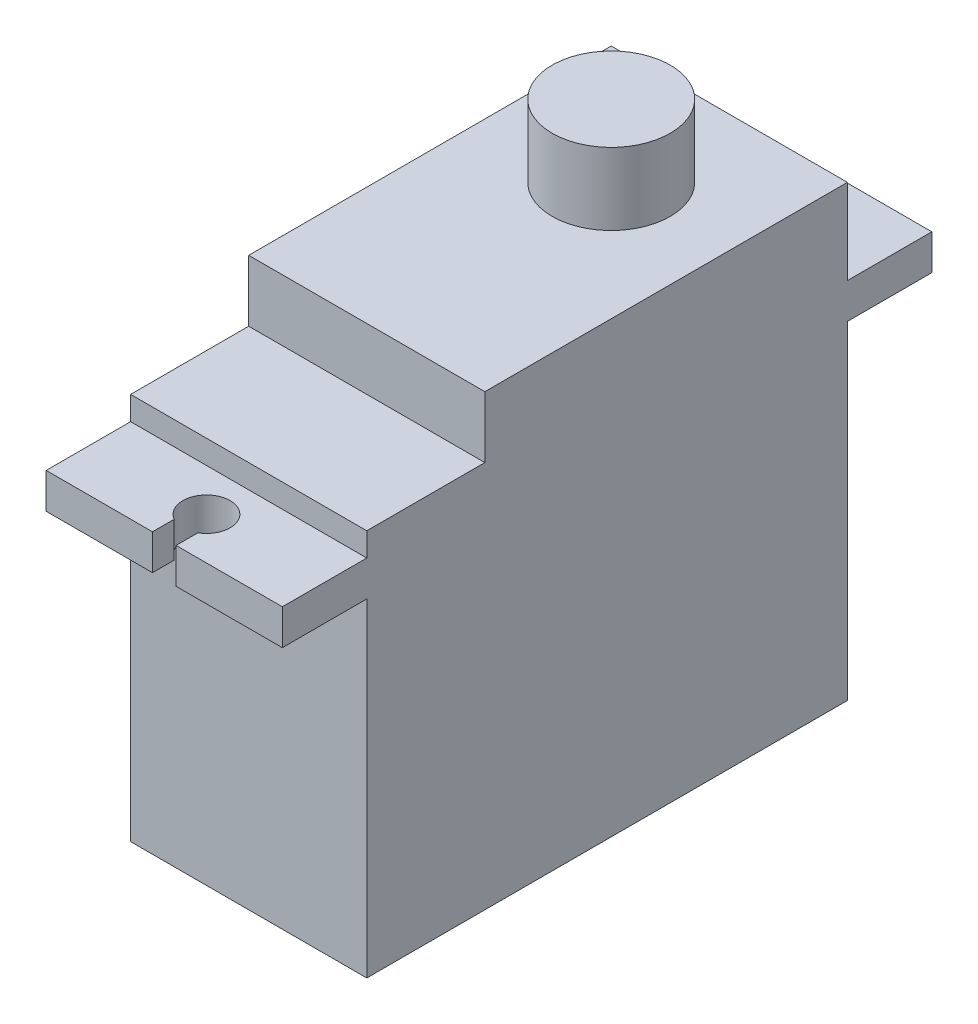
ISO-10303-21;
HEADER;
FILE_DESCRIPTION(('STEP AP214'),'2;1');
FILE_NAME('part.step','',(''),(''),'','','');
FILE_SCHEMA(('AUTOMOTIVE_DESIGN { 1 0 10303 214 1 1 1 1 }'));
ENDSEC;
DATA;
#1=APPLICATION_CONTEXT('core data for automotive mechanical design processes');
#2=APPLICATION_PROTOCOL_DEFINITION('international standard','automotive_design',2000,#1);
#3=PRODUCT_CONTEXT('',#1,'mechanical');
#4=PRODUCT('Part','Part','',(#3));
#5=PRODUCT_RELATED_PRODUCT_CATEGORY('part','',(#4));
#6=PRODUCT_DEFINITION_FORMATION('','',#4);
#7=PRODUCT_DEFINITION_CONTEXT('part definition',#1,'design');
#8=PRODUCT_DEFINITION('design','',#6,#7);
#9=PRODUCT_DEFINITION_SHAPE('','',#8);
#10=(LENGTH_UNIT() NAMED_UNIT(*) SI_UNIT(.MILLI.,.METRE.));
#11=(NAMED_UNIT(*) PLANE_ANGLE_UNIT() SI_UNIT($,.RADIAN.));
#12=(NAMED_UNIT(*) SI_UNIT($,.STERADIAN.) SOLID_ANGLE_UNIT());
#13=UNCERTAINTY_MEASURE_WITH_UNIT(LENGTH_MEASURE(1.E-05),#10,'distance_accuracy_value','');
#14=(GEOMETRIC_REPRESENTATION_CONTEXT(3) GLOBAL_UNCERTAINTY_ASSIGNED_CONTEXT((#13)) GLOBAL_UNIT_ASSIGNED_CONTEXT((#10,
#11,#12)) REPRESENTATION_CONTEXT('',''));
#15=CARTESIAN_POINT('',(0.,0.,0.));
#16=DIRECTION('',(0.,0.,1.));
#17=DIRECTION('',(1.,0.,0.));
#18=AXIS2_PLACEMENT_3D('',#15,#16,#17);
#19=CARTESIAN_POINT('',(10.,0.,27.5));
#20=DIRECTION('',(0.,0.,1.));
#21=DIRECTION('',(0.,-1.,0.));
#22=AXIS2_PLACEMENT_3D('',#19,#20,#21);
#23=PLANE('',#22);
#24=DIRECTION('',(-1.,0.,0.));
#25=VECTOR('',#24,1.);
#26=CARTESIAN_POINT('',(10.,11.4,27.5));
#27=LINE('',#26,#25);
#28=CARTESIAN_POINT('',(-1.,11.4,27.5));
#29=VERTEX_POINT('',#28);
#30=CARTESIAN_POINT('',(-10.,11.4,27.5));
#31=VERTEX_POINT('',#30);
#32=EDGE_CURVE('E399',#29,#31,#27,.T.);
#33=ORIENTED_EDGE('',*,*,#32,.F.);
#34=DIRECTION('',(0.,1.,0.));
#35=VECTOR('',#34,1.);
#36=CARTESIAN_POINT('',(-1.,-16.4,27.5));
#37=LINE('',#36,#35);
#38=CARTESIAN_POINT('',(-1.,14.4,27.5));
#39=VERTEX_POINT('',#38);
#40=EDGE_CURVE('E223',#29,#39,#37,.T.);
#41=ORIENTED_EDGE('',*,*,#40,.T.);
#42=DIRECTION('',(-1.,0.,0.));
#43=VECTOR('',#42,1.);
#44=CARTESIAN_POINT('',(10.,14.4,27.5));
#45=LINE('',#44,#43);
#46=CARTESIAN_POINT('',(-10.,14.4,27.5));
#47=VERTEX_POINT('',#46);
#48=EDGE_CURVE('E404',#39,#47,#45,.T.);
#49=ORIENTED_EDGE('',*,*,#48,.T.);
#50=DIRECTION('',(0.,1.,0.));
#51=VECTOR('',#50,1.);
#52=CARTESIAN_POINT('',(-10.,0.,27.5));
#53=LINE('',#52,#51);
#54=EDGE_CURVE('E330',#31,#47,#53,.T.);
#55=ORIENTED_EDGE('',*,*,#54,.F.);
#56=EDGE_LOOP('',(#33,#41,#49,#55));
#57=FACE_BOUND('',#56,.T.);
#58=ADVANCED_FACE('F41',(#57),#23,.T.);
#59=CARTESIAN_POINT('',(10.,0.,-27.5));
#60=DIRECTION('',(0.,0.,-1.));
#61=DIRECTION('',(-1.,0.,0.));
#62=AXIS2_PLACEMENT_3D('',#59,#60,#61);
#63=PLANE('',#62);
#64=DIRECTION('',(-1.,0.,0.));
#65=VECTOR('',#64,1.);
#66=CARTESIAN_POINT('',(10.,11.4,-27.5));
#67=LINE('',#66,#65);
#68=CARTESIAN_POINT('',(10.,11.4,-27.5));
#69=VERTEX_POINT('',#68);
#70=CARTESIAN_POINT('',(1.,11.4,-27.5));
#71=VERTEX_POINT('',#70);
#72=EDGE_CURVE('E383',#69,#71,#67,.T.);
#73=ORIENTED_EDGE('',*,*,#72,.T.);
#74=DIRECTION('',(0.,1.,0.));
#75=VECTOR('',#74,1.);
#76=CARTESIAN_POINT('',(1.,-16.4,-27.5));
#77=LINE('',#76,#75);
#78=CARTESIAN_POINT('',(1.,14.4,-27.5));
#79=VERTEX_POINT('',#78);
#80=EDGE_CURVE('E245',#71,#79,#77,.T.);
#81=ORIENTED_EDGE('',*,*,#80,.T.);
#82=DIRECTION('',(-1.,0.,0.));
#83=VECTOR('',#82,1.);
#84=CARTESIAN_POINT('',(10.,14.4,-27.5));
#85=LINE('',#84,#83);
#86=CARTESIAN_POINT('',(10.,14.4,-27.5));
#87=VERTEX_POINT('',#86);
#88=EDGE_CURVE('E378',#87,#79,#85,.T.);
#89=ORIENTED_EDGE('',*,*,#88,.F.);
#90=DIRECTION('',(0.,-1.,0.));
#91=VECTOR('',#90,1.);
#92=CARTESIAN_POINT('',(10.,0.,-27.5));
#93=LINE('',#92,#91);
#94=EDGE_CURVE('E302',#87,#69,#93,.T.);
#95=ORIENTED_EDGE('',*,*,#94,.T.);
#96=EDGE_LOOP('',(#73,#81,#89,#95));
#97=FACE_BOUND('',#96,.T.);
#98=ADVANCED_FACE('F503',(#97),#63,.T.);
#99=CARTESIAN_POINT('',(10.,16.4,0.));
#100=DIRECTION('',(0.,-1.,0.));
#101=DIRECTION('',(0.,0.,-1.));
#102=AXIS2_PLACEMENT_3D('',#99,#100,#101);
#103=PLANE('',#102);
#104=DIRECTION('',(0.,0.,1.));
#105=VECTOR('',#104,1.);
#106=CARTESIAN_POINT('',(-10.,16.4,0.));
#107=LINE('',#106,#105);
#108=CARTESIAN_POINT('',(-10.,16.4,10.35));
#109=VERTEX_POINT('',#108);
#110=CARTESIAN_POINT('',(-10.,16.4,20.35));
#111=VERTEX_POINT('',#110);
#112=EDGE_CURVE('E266',#109,#111,#107,.T.);
#113=ORIENTED_EDGE('',*,*,#112,.T.);
#114=DIRECTION('',(-1.,0.,0.));
#115=VECTOR('',#114,1.);
#116=CARTESIAN_POINT('',(10.,16.4,20.35));
#117=LINE('',#116,#115);
#118=CARTESIAN_POINT('',(10.,16.4,20.35));
#119=VERTEX_POINT('',#118);
#120=EDGE_CURVE('E412',#119,#111,#117,.T.);
#121=ORIENTED_EDGE('',*,*,#120,.F.);
#122=DIRECTION('',(0.,0.,1.));
#123=VECTOR('',#122,1.);
#124=CARTESIAN_POINT('',(10.,16.4,0.));
#125=LINE('',#124,#123);
#126=CARTESIAN_POINT('',(10.,16.4,10.35));
#127=VERTEX_POINT('',#126);
#128=EDGE_CURVE('E270',#127,#119,#125,.T.);
#129=ORIENTED_EDGE('',*,*,#128,.F.);
#130=DIRECTION('',(-1.,0.,0.));
#131=VECTOR('',#130,1.);
#132=CARTESIAN_POINT('',(10.,16.4,10.35));
#133=LINE('',#132,#131);
#134=EDGE_CURVE('E318',#127,#109,#133,.T.);
#135=ORIENTED_EDGE('',*,*,#134,.T.);
#136=EDGE_LOOP('',(#113,#121,#129,#135));
#137=FACE_BOUND('',#136,.T.);
#138=ADVANCED_FACE('F43',(#137),#103,.F.);
#139=CARTESIAN_POINT('',(10.,0.,20.35));
#140=DIRECTION('',(0.,0.,-1.));
#141=DIRECTION('',(-1.,0.,0.));
#142=AXIS2_PLACEMENT_3D('',#139,#140,#141);
#143=PLANE('',#142);
#144=DIRECTION('',(0.,-1.,0.));
#145=VECTOR('',#144,1.);
#146=CARTESIAN_POINT('',(-10.,0.,20.35));
#147=LINE('',#146,#145);
#148=CARTESIAN_POINT('',(-10.,14.4,20.35));
#149=VERTEX_POINT('',#148);
#150=EDGE_CURVE('E322',#111,#149,#147,.T.);
#151=ORIENTED_EDGE('',*,*,#150,.T.);
#152=DIRECTION('',(-1.,0.,0.));
#153=VECTOR('',#152,1.);
#154=CARTESIAN_POINT('',(10.,14.4,20.35));
#155=LINE('',#154,#153);
#156=CARTESIAN_POINT('',(10.,14.4,20.35));
#157=VERTEX_POINT('',#156);
#158=EDGE_CURVE('E408',#157,#149,#155,.T.);
#159=ORIENTED_EDGE('',*,*,#158,.F.);
#160=DIRECTION('',(0.,-1.,0.));
#161=VECTOR('',#160,1.);
#162=CARTESIAN_POINT('',(10.,0.,20.35));
#163=LINE('',#162,#161);
#164=EDGE_CURVE('E274',#119,#157,#163,.T.);
#165=ORIENTED_EDGE('',*,*,#164,.F.);
#166=ORIENTED_EDGE('',*,*,#120,.T.);
#167=EDGE_LOOP('',(#151,#159,#165,#166));
#168=FACE_BOUND('',#167,.T.);
#169=ADVANCED_FACE('F487',(#168),#143,.F.);
#170=CARTESIAN_POINT('',(10.,14.4,0.));
#171=DIRECTION('',(0.,-1.,0.));
#172=DIRECTION('',(0.,0.,-1.));
#173=AXIS2_PLACEMENT_3D('',#170,#171,#172);
#174=PLANE('',#173);
#175=CARTESIAN_POINT('',(0.,14.4,23.925));
#176=DIRECTION('',(0.,1.,0.));
#177=DIRECTION('',(0.,0.,1.));
#178=AXIS2_PLACEMENT_3D('',#175,#176,#177);
#179=CIRCLE('',#178,2.);
#180=CARTESIAN_POINT('',(1.,14.4,25.6570508075689));
#181=VERTEX_POINT('',#180);
#182=CARTESIAN_POINT('',(-1.,14.4,25.6570508075689));
#183=VERTEX_POINT('',#182);
#184=EDGE_CURVE('E193',#181,#183,#179,.T.);
#185=ORIENTED_EDGE('',*,*,#184,.F.);
#186=DIRECTION('',(0.,0.,-1.));
#187=VECTOR('',#186,1.);
#188=CARTESIAN_POINT('',(1.,14.4,0.));
#189=LINE('',#188,#187);
#190=CARTESIAN_POINT('',(1.,14.4,27.5));
#191=VERTEX_POINT('',#190);
#192=EDGE_CURVE('E203',#191,#181,#189,.T.);
#193=ORIENTED_EDGE('',*,*,#192,.F.);
#194=CARTESIAN_POINT('',(10.,14.4,27.5));
#195=VERTEX_POINT('',#194);
#196=EDGE_CURVE('E405',#195,#191,#45,.T.);
#197=ORIENTED_EDGE('',*,*,#196,.F.);
#198=DIRECTION('',(0.,0.,1.));
#199=VECTOR('',#198,1.);
#200=CARTESIAN_POINT('',(10.,14.4,0.));
#201=LINE('',#200,#199);
#202=EDGE_CURVE('E278',#157,#195,#201,.T.);
#203=ORIENTED_EDGE('',*,*,#202,.F.);
#204=ORIENTED_EDGE('',*,*,#158,.T.);
#205=DIRECTION('',(0.,0.,1.));
#206=VECTOR('',#205,1.);
#207=CARTESIAN_POINT('',(-10.,14.4,0.));
#208=LINE('',#207,#206);
#209=EDGE_CURVE('E325',#149,#47,#208,.T.);
#210=ORIENTED_EDGE('',*,*,#209,.T.);
#211=ORIENTED_EDGE('',*,*,#48,.F.);
#212=DIRECTION('',(0.,0.,-1.));
#213=VECTOR('',#212,1.);
#214=CARTESIAN_POINT('',(-1.,14.4,0.));
#215=LINE('',#214,#213);
#216=EDGE_CURVE('E200',#39,#183,#215,.T.);
#217=ORIENTED_EDGE('',*,*,#216,.T.);
#218=EDGE_LOOP('',(#185,#193,#197,#203,#204,#210,#211,#217));
#219=FACE_BOUND('',#218,.T.);
#220=ADVANCED_FACE('F213',(#219),#174,.F.);
#221=DIRECTION('',(0.,1.,0.));
#222=VECTOR('',#221,1.);
#223=CARTESIAN_POINT('',(1.,-16.4,27.5));
#224=LINE('',#223,#222);
#225=CARTESIAN_POINT('',(1.,11.4,27.5));
#226=VERTEX_POINT('',#225);
#227=EDGE_CURVE('E206',#226,#191,#224,.T.);
#228=ORIENTED_EDGE('',*,*,#227,.F.);
#229=CARTESIAN_POINT('',(10.,11.4,27.5));
#230=VERTEX_POINT('',#229);
#231=EDGE_CURVE('E400',#230,#226,#27,.T.);
#232=ORIENTED_EDGE('',*,*,#231,.F.);
#233=DIRECTION('',(0.,1.,0.));
#234=VECTOR('',#233,1.);
#235=CARTESIAN_POINT('',(10.,0.,27.5));
#236=LINE('',#235,#234);
#237=EDGE_CURVE('E282',#230,#195,#236,.T.);
#238=ORIENTED_EDGE('',*,*,#237,.T.);
#239=ORIENTED_EDGE('',*,*,#196,.T.);
#240=EDGE_LOOP('',(#228,#232,#238,#239));
#241=FACE_BOUND('',#240,.T.);
#242=ADVANCED_FACE('F511',(#241),#23,.T.);
#243=CARTESIAN_POINT('',(10.,11.4,0.));
#244=DIRECTION('',(0.,-1.,0.));
#245=DIRECTION('',(0.,0.,-1.));
#246=AXIS2_PLACEMENT_3D('',#243,#244,#245);
#247=PLANE('',#246);
#248=DIRECTION('',(0.,0.,1.));
#249=VECTOR('',#248,1.);
#250=CARTESIAN_POINT('',(0.999999999999999,11.4,0.));
#251=LINE('',#250,#249);
#252=CARTESIAN_POINT('',(1.,11.4,25.6570508075689));
#253=VERTEX_POINT('',#252);
#254=EDGE_CURVE('E11',#253,#226,#251,.T.);
#255=ORIENTED_EDGE('',*,*,#254,.F.);
#256=CARTESIAN_POINT('',(0.,11.4,23.925));
#257=DIRECTION('',(0.,-1.,0.));
#258=DIRECTION('',(0.,0.,-1.));
#259=AXIS2_PLACEMENT_3D('',#256,#257,#258);
#260=CIRCLE('',#259,2.);
#261=CARTESIAN_POINT('',(-0.999999999999995,11.4,25.6570508075689));
#262=VERTEX_POINT('',#261);
#263=EDGE_CURVE('E196',#262,#253,#260,.T.);
#264=ORIENTED_EDGE('',*,*,#263,.F.);
#265=DIRECTION('',(0.,0.,1.));
#266=VECTOR('',#265,1.);
#267=CARTESIAN_POINT('',(-0.999999999999999,11.4,0.));
#268=LINE('',#267,#266);
#269=EDGE_CURVE('E50',#262,#29,#268,.T.);
#270=ORIENTED_EDGE('',*,*,#269,.T.);
#271=ORIENTED_EDGE('',*,*,#32,.T.);
#272=DIRECTION('',(0.,0.,1.));
#273=VECTOR('',#272,1.);
#274=CARTESIAN_POINT('',(-10.,11.4,0.));
#275=LINE('',#274,#273);
#276=CARTESIAN_POINT('',(-10.,11.4,20.35));
#277=VERTEX_POINT('',#276);
#278=EDGE_CURVE('E334',#277,#31,#275,.T.);
#279=ORIENTED_EDGE('',*,*,#278,.F.);
#280=DIRECTION('',(-1.,0.,0.));
#281=VECTOR('',#280,1.);
#282=CARTESIAN_POINT('',(10.,11.4,20.35));
#283=LINE('',#282,#281);
#284=CARTESIAN_POINT('',(10.,11.4,20.35));
#285=VERTEX_POINT('',#284);
#286=EDGE_CURVE('E396',#285,#277,#283,.T.);
#287=ORIENTED_EDGE('',*,*,#286,.F.);
#288=DIRECTION('',(0.,0.,1.));
#289=VECTOR('',#288,1.);
#290=CARTESIAN_POINT('',(10.,11.4,0.));
#291=LINE('',#290,#289);
#292=EDGE_CURVE('E286',#285,#230,#291,.T.);
#293=ORIENTED_EDGE('',*,*,#292,.T.);
#294=ORIENTED_EDGE('',*,*,#231,.T.);
#295=EDGE_LOOP('',(#255,#264,#270,#271,#279,#287,#293,#294));
#296=FACE_BOUND('',#295,.T.);
#297=ADVANCED_FACE('F421',(#296),#247,.T.);
#298=CARTESIAN_POINT('',(-10.,-16.4,20.35));
#299=VERTEX_POINT('',#298);
#300=EDGE_CURVE('E326',#277,#299,#147,.T.);
#301=ORIENTED_EDGE('',*,*,#300,.T.);
#302=DIRECTION('',(-1.,0.,0.));
#303=VECTOR('',#302,1.);
#304=CARTESIAN_POINT('',(10.,-16.4,20.35));
#305=LINE('',#304,#303);
#306=CARTESIAN_POINT('',(10.,-16.4,20.35));
#307=VERTEX_POINT('',#306);
#308=EDGE_CURVE('E393',#307,#299,#305,.T.);
#309=ORIENTED_EDGE('',*,*,#308,.F.);
#310=EDGE_CURVE('E279',#285,#307,#163,.T.);
#311=ORIENTED_EDGE('',*,*,#310,.F.);
#312=ORIENTED_EDGE('',*,*,#286,.T.);
#313=EDGE_LOOP('',(#301,#309,#311,#312));
#314=FACE_BOUND('',#313,.T.);
#315=ADVANCED_FACE('F440',(#314),#143,.F.);
#316=CARTESIAN_POINT('',(10.,-16.4,0.));
#317=DIRECTION('',(0.,-1.,0.));
#318=DIRECTION('',(0.,0.,-1.));
#319=AXIS2_PLACEMENT_3D('',#316,#317,#318);
#320=PLANE('',#319);
#321=DIRECTION('',(0.,0.,1.));
#322=VECTOR('',#321,1.);
#323=CARTESIAN_POINT('',(-10.,-16.4,0.));
#324=LINE('',#323,#322);
#325=CARTESIAN_POINT('',(-10.,-16.4,-20.35));
#326=VERTEX_POINT('',#325);
#327=EDGE_CURVE('E338',#326,#299,#324,.T.);
#328=ORIENTED_EDGE('',*,*,#327,.F.);
#329=DIRECTION('',(-1.,0.,0.));
#330=VECTOR('',#329,1.);
#331=CARTESIAN_POINT('',(10.,-16.4,-20.35));
#332=LINE('',#331,#330);
#333=CARTESIAN_POINT('',(10.,-16.4,-20.35));
#334=VERTEX_POINT('',#333);
#335=EDGE_CURVE('E390',#334,#326,#332,.T.);
#336=ORIENTED_EDGE('',*,*,#335,.F.);
#337=DIRECTION('',(0.,0.,1.));
#338=VECTOR('',#337,1.);
#339=CARTESIAN_POINT('',(10.,-16.4,0.));
#340=LINE('',#339,#338);
#341=EDGE_CURVE('E290',#334,#307,#340,.T.);
#342=ORIENTED_EDGE('',*,*,#341,.T.);
#343=ORIENTED_EDGE('',*,*,#308,.T.);
#344=EDGE_LOOP('',(#328,#336,#342,#343));
#345=FACE_BOUND('',#344,.T.);
#346=ADVANCED_FACE('F449',(#345),#320,.T.);
#347=CARTESIAN_POINT('',(10.,0.,-20.35));
#348=DIRECTION('',(0.,0.,-1.));
#349=DIRECTION('',(0.,1.,0.));
#350=AXIS2_PLACEMENT_3D('',#347,#348,#349);
#351=PLANE('',#350);
#352=DIRECTION('',(0.,-1.,0.));
#353=VECTOR('',#352,1.);
#354=CARTESIAN_POINT('',(-10.,0.,-20.35));
#355=LINE('',#354,#353);
#356=CARTESIAN_POINT('',(-10.,11.4,-20.35));
#357=VERTEX_POINT('',#356);
#358=EDGE_CURVE('E342',#357,#326,#355,.T.);
#359=ORIENTED_EDGE('',*,*,#358,.F.);
#360=DIRECTION('',(-1.,0.,0.));
#361=VECTOR('',#360,1.);
#362=CARTESIAN_POINT('',(10.,11.4,-20.35));
#363=LINE('',#362,#361);
#364=CARTESIAN_POINT('',(10.,11.4,-20.35));
#365=VERTEX_POINT('',#364);
#366=EDGE_CURVE('E387',#365,#357,#363,.T.);
#367=ORIENTED_EDGE('',*,*,#366,.F.);
#368=DIRECTION('',(0.,-1.,0.));
#369=VECTOR('',#368,1.);
#370=CARTESIAN_POINT('',(10.,0.,-20.35));
#371=LINE('',#370,#369);
#372=EDGE_CURVE('E294',#365,#334,#371,.T.);
#373=ORIENTED_EDGE('',*,*,#372,.T.);
#374=ORIENTED_EDGE('',*,*,#335,.T.);
#375=EDGE_LOOP('',(#359,#367,#373,#374));
#376=FACE_BOUND('',#375,.T.);
#377=ADVANCED_FACE('F456',(#376),#351,.T.);
#378=CARTESIAN_POINT('',(10.,11.4,0.));
#379=DIRECTION('',(0.,1.,0.));
#380=DIRECTION('',(0.,0.,1.));
#381=AXIS2_PLACEMENT_3D('',#378,#379,#380);
#382=PLANE('',#381);
#383=CARTESIAN_POINT('',(-1.,11.4,-27.5));
#384=VERTEX_POINT('',#383);
#385=CARTESIAN_POINT('',(-10.,11.4,-27.5));
#386=VERTEX_POINT('',#385);
#387=EDGE_CURVE('E382',#384,#386,#67,.T.);
#388=ORIENTED_EDGE('',*,*,#387,.F.);
#389=DIRECTION('',(0.,0.,1.));
#390=VECTOR('',#389,1.);
#391=CARTESIAN_POINT('',(-0.999999999999994,11.4,0.));
#392=LINE('',#391,#390);
#393=CARTESIAN_POINT('',(-1.,11.4,-25.6570508075689));
#394=VERTEX_POINT('',#393);
#395=EDGE_CURVE('E253',#384,#394,#392,.T.);
#396=ORIENTED_EDGE('',*,*,#395,.T.);
#397=CARTESIAN_POINT('',(0.,11.4,-23.925));
#398=DIRECTION('',(0.,1.,0.));
#399=DIRECTION('',(0.,0.,1.));
#400=AXIS2_PLACEMENT_3D('',#397,#398,#399);
#401=CIRCLE('',#400,2.);
#402=CARTESIAN_POINT('',(1.,11.4,-25.6570508075689));
#403=VERTEX_POINT('',#402);
#404=EDGE_CURVE('E257',#394,#403,#401,.T.);
#405=ORIENTED_EDGE('',*,*,#404,.T.);
#406=DIRECTION('',(0.,0.,1.));
#407=VECTOR('',#406,1.);
#408=CARTESIAN_POINT('',(0.999999999999994,11.4,0.));
#409=LINE('',#408,#407);
#410=EDGE_CURVE('E222',#71,#403,#409,.T.);
#411=ORIENTED_EDGE('',*,*,#410,.F.);
#412=ORIENTED_EDGE('',*,*,#72,.F.);
#413=DIRECTION('',(0.,0.,-1.));
#414=VECTOR('',#413,1.);
#415=CARTESIAN_POINT('',(10.,11.4,0.));
#416=LINE('',#415,#414);
#417=EDGE_CURVE('E298',#365,#69,#416,.T.);
#418=ORIENTED_EDGE('',*,*,#417,.F.);
#419=ORIENTED_EDGE('',*,*,#366,.T.);
#420=DIRECTION('',(0.,0.,-1.));
#421=VECTOR('',#420,1.);
#422=CARTESIAN_POINT('',(-10.,11.4,0.));
#423=LINE('',#422,#421);
#424=EDGE_CURVE('E346',#357,#386,#423,.T.);
#425=ORIENTED_EDGE('',*,*,#424,.T.);
#426=EDGE_LOOP('',(#388,#396,#405,#411,#412,#418,#419,#425));
#427=FACE_BOUND('',#426,.T.);
#428=ADVANCED_FACE('F461',(#427),#382,.F.);
#429=DIRECTION('',(0.,1.,0.));
#430=VECTOR('',#429,1.);
#431=CARTESIAN_POINT('',(-1.,-16.4,-27.5));
#432=LINE('',#431,#430);
#433=CARTESIAN_POINT('',(-1.,14.4,-27.5));
#434=VERTEX_POINT('',#433);
#435=EDGE_CURVE('E242',#384,#434,#432,.T.);
#436=ORIENTED_EDGE('',*,*,#435,.F.);
#437=ORIENTED_EDGE('',*,*,#387,.T.);
#438=DIRECTION('',(0.,-1.,0.));
#439=VECTOR('',#438,1.);
#440=CARTESIAN_POINT('',(-10.,0.,-27.5));
#441=LINE('',#440,#439);
#442=CARTESIAN_POINT('',(-10.,14.4,-27.5));
#443=VERTEX_POINT('',#442);
#444=EDGE_CURVE('E351',#443,#386,#441,.T.);
#445=ORIENTED_EDGE('',*,*,#444,.F.);
#446=EDGE_CURVE('E377',#434,#443,#85,.T.);
#447=ORIENTED_EDGE('',*,*,#446,.F.);
#448=EDGE_LOOP('',(#436,#437,#445,#447));
#449=FACE_BOUND('',#448,.T.);
#450=ADVANCED_FACE('F496',(#449),#63,.T.);
#451=CARTESIAN_POINT('',(10.,14.4,0.));
#452=DIRECTION('',(0.,1.,0.));
#453=DIRECTION('',(0.,0.,1.));
#454=AXIS2_PLACEMENT_3D('',#451,#452,#453);
#455=PLANE('',#454);
#456=DIRECTION('',(0.,0.,1.));
#457=VECTOR('',#456,1.);
#458=CARTESIAN_POINT('',(-0.999999999999994,14.4,0.));
#459=LINE('',#458,#457);
#460=CARTESIAN_POINT('',(-1.,14.4,-25.6570508075689));
#461=VERTEX_POINT('',#460);
#462=EDGE_CURVE('E235',#434,#461,#459,.T.);
#463=ORIENTED_EDGE('',*,*,#462,.F.);
#464=ORIENTED_EDGE('',*,*,#446,.T.);
#465=DIRECTION('',(0.,0.,-1.));
#466=VECTOR('',#465,1.);
#467=CARTESIAN_POINT('',(-10.,14.4,0.));
#468=LINE('',#467,#466);
#469=CARTESIAN_POINT('',(-10.,14.4,-20.35));
#470=VERTEX_POINT('',#469);
#471=EDGE_CURVE('E355',#470,#443,#468,.T.);
#472=ORIENTED_EDGE('',*,*,#471,.F.);
#473=DIRECTION('',(-1.,0.,0.));
#474=VECTOR('',#473,1.);
#475=CARTESIAN_POINT('',(10.,14.4,-20.35));
#476=LINE('',#475,#474);
#477=CARTESIAN_POINT('',(10.,14.4,-20.35));
#478=VERTEX_POINT('',#477);
#479=EDGE_CURVE('E374',#478,#470,#476,.T.);
#480=ORIENTED_EDGE('',*,*,#479,.F.);
#481=DIRECTION('',(0.,0.,-1.));
#482=VECTOR('',#481,1.);
#483=CARTESIAN_POINT('',(10.,14.4,0.));
#484=LINE('',#483,#482);
#485=EDGE_CURVE('E306',#478,#87,#484,.T.);
#486=ORIENTED_EDGE('',*,*,#485,.T.);
#487=ORIENTED_EDGE('',*,*,#88,.T.);
#488=DIRECTION('',(0.,0.,1.));
#489=VECTOR('',#488,1.);
#490=CARTESIAN_POINT('',(0.999999999999994,14.4,0.));
#491=LINE('',#490,#489);
#492=CARTESIAN_POINT('',(1.,14.4,-25.6570508075689));
#493=VERTEX_POINT('',#492);
#494=EDGE_CURVE('E231',#79,#493,#491,.T.);
#495=ORIENTED_EDGE('',*,*,#494,.T.);
#496=CARTESIAN_POINT('',(0.,14.4,-23.925));
#497=DIRECTION('',(0.,1.,0.));
#498=DIRECTION('',(0.,0.,1.));
#499=AXIS2_PLACEMENT_3D('',#496,#497,#498);
#500=CIRCLE('',#499,2.);
#501=EDGE_CURVE('E65',#461,#493,#500,.T.);
#502=ORIENTED_EDGE('',*,*,#501,.F.);
#503=EDGE_LOOP('',(#463,#464,#472,#480,#486,#487,#495,#502));
#504=FACE_BOUND('',#503,.T.);
#505=ADVANCED_FACE('F469',(#504),#455,.T.);
#506=CARTESIAN_POINT('',(-10.,21.6,-20.35));
#507=VERTEX_POINT('',#506);
#508=EDGE_CURVE('E347',#507,#470,#355,.T.);
#509=ORIENTED_EDGE('',*,*,#508,.F.);
#510=DIRECTION('',(-1.,0.,0.));
#511=VECTOR('',#510,1.);
#512=CARTESIAN_POINT('',(10.,21.6,-20.35));
#513=LINE('',#512,#511);
#514=CARTESIAN_POINT('',(10.,21.6,-20.35));
#515=VERTEX_POINT('',#514);
#516=EDGE_CURVE('E371',#515,#507,#513,.T.);
#517=ORIENTED_EDGE('',*,*,#516,.F.);
#518=EDGE_CURVE('E299',#515,#478,#371,.T.);
#519=ORIENTED_EDGE('',*,*,#518,.T.);
#520=ORIENTED_EDGE('',*,*,#479,.T.);
#521=EDGE_LOOP('',(#509,#517,#519,#520));
#522=FACE_BOUND('',#521,.T.);
#523=ADVANCED_FACE('F473',(#522),#351,.T.);
#524=CARTESIAN_POINT('',(10.,21.6,0.));
#525=DIRECTION('',(0.,1.,0.));
#526=DIRECTION('',(0.,0.,1.));
#527=AXIS2_PLACEMENT_3D('',#524,#525,#526);
#528=PLANE('',#527);
#529=CARTESIAN_POINT('',(0.,21.6,-10.35));
#530=DIRECTION('',(0.,1.,0.));
#531=DIRECTION('',(0.,0.,1.));
#532=AXIS2_PLACEMENT_3D('',#529,#530,#531);
#533=CIRCLE('',#532,5.);
#534=CARTESIAN_POINT('',(0.,21.6,-5.34999999999999));
#535=VERTEX_POINT('',#534);
#536=EDGE_CURVE('E261',#535,#535,#533,.T.);
#537=ORIENTED_EDGE('',*,*,#536,.F.);
#538=EDGE_LOOP('',(#537));
#539=FACE_BOUND('',#538,.T.);
#540=DIRECTION('',(0.,0.,-1.));
#541=VECTOR('',#540,1.);
#542=CARTESIAN_POINT('',(-10.,21.6,0.));
#543=LINE('',#542,#541);
#544=CARTESIAN_POINT('',(-10.,21.6,10.35));
#545=VERTEX_POINT('',#544);
#546=EDGE_CURVE('E359',#545,#507,#543,.T.);
#547=ORIENTED_EDGE('',*,*,#546,.F.);
#548=DIRECTION('',(-1.,0.,0.));
#549=VECTOR('',#548,1.);
#550=CARTESIAN_POINT('',(10.,21.6,10.35));
#551=LINE('',#550,#549);
#552=CARTESIAN_POINT('',(10.,21.6,10.35));
#553=VERTEX_POINT('',#552);
#554=EDGE_CURVE('E368',#553,#545,#551,.T.);
#555=ORIENTED_EDGE('',*,*,#554,.F.);
#556=DIRECTION('',(0.,0.,-1.));
#557=VECTOR('',#556,1.);
#558=CARTESIAN_POINT('',(10.,21.6,0.));
#559=LINE('',#558,#557);
#560=EDGE_CURVE('E310',#553,#515,#559,.T.);
#561=ORIENTED_EDGE('',*,*,#560,.T.);
#562=ORIENTED_EDGE('',*,*,#516,.T.);
#563=EDGE_LOOP('',(#547,#555,#561,#562));
#564=FACE_BOUND('',#563,.T.);
#565=ADVANCED_FACE('F478',(#539,#564),#528,.T.);
#566=CARTESIAN_POINT('',(10.,0.,10.35));
#567=DIRECTION('',(0.,0.,1.));
#568=DIRECTION('',(1.,0.,0.));
#569=AXIS2_PLACEMENT_3D('',#566,#567,#568);
#570=PLANE('',#569);
#571=DIRECTION('',(0.,1.,0.));
#572=VECTOR('',#571,1.);
#573=CARTESIAN_POINT('',(-10.,0.,10.35));
#574=LINE('',#573,#572);
#575=EDGE_CURVE('E275',#109,#545,#574,.T.);
#576=ORIENTED_EDGE('',*,*,#575,.F.);
#577=ORIENTED_EDGE('',*,*,#134,.F.);
#578=DIRECTION('',(0.,1.,0.));
#579=VECTOR('',#578,1.);
#580=CARTESIAN_POINT('',(10.,0.,10.35));
#581=LINE('',#580,#579);
#582=EDGE_CURVE('E314',#127,#553,#581,.T.);
#583=ORIENTED_EDGE('',*,*,#582,.T.);
#584=ORIENTED_EDGE('',*,*,#554,.T.);
#585=EDGE_LOOP('',(#576,#577,#583,#584));
#586=FACE_BOUND('',#585,.T.);
#587=ADVANCED_FACE('F481',(#586),#570,.T.);
#588=CARTESIAN_POINT('',(10.,0.,0.));
#589=DIRECTION('',(1.,0.,0.));
#590=DIRECTION('',(0.,0.,-1.));
#591=AXIS2_PLACEMENT_3D('',#588,#589,#590);
#592=PLANE('',#591);
#593=ORIENTED_EDGE('',*,*,#128,.T.);
#594=ORIENTED_EDGE('',*,*,#164,.T.);
#595=ORIENTED_EDGE('',*,*,#202,.T.);
#596=ORIENTED_EDGE('',*,*,#237,.F.);
#597=ORIENTED_EDGE('',*,*,#292,.F.);
#598=ORIENTED_EDGE('',*,*,#310,.T.);
#599=ORIENTED_EDGE('',*,*,#341,.F.);
#600=ORIENTED_EDGE('',*,*,#372,.F.);
#601=ORIENTED_EDGE('',*,*,#417,.T.);
#602=ORIENTED_EDGE('',*,*,#94,.F.);
#603=ORIENTED_EDGE('',*,*,#485,.F.);
#604=ORIENTED_EDGE('',*,*,#518,.F.);
#605=ORIENTED_EDGE('',*,*,#560,.F.);
#606=ORIENTED_EDGE('',*,*,#582,.F.);
#607=EDGE_LOOP('',(#593,#594,#595,#596,#597,#598,#599,#600,#601,#602,#603,#604,#605,#606));
#608=FACE_BOUND('',#607,.T.);
#609=ADVANCED_FACE('F453',(#608),#592,.T.);
#610=CARTESIAN_POINT('',(-10.,0.,0.));
#611=DIRECTION('',(1.,0.,0.));
#612=DIRECTION('',(0.,0.,-1.));
#613=AXIS2_PLACEMENT_3D('',#610,#611,#612);
#614=PLANE('',#613);
#615=ORIENTED_EDGE('',*,*,#112,.F.);
#616=ORIENTED_EDGE('',*,*,#575,.T.);
#617=ORIENTED_EDGE('',*,*,#546,.T.);
#618=ORIENTED_EDGE('',*,*,#508,.T.);
#619=ORIENTED_EDGE('',*,*,#471,.T.);
#620=ORIENTED_EDGE('',*,*,#444,.T.);
#621=ORIENTED_EDGE('',*,*,#424,.F.);
#622=ORIENTED_EDGE('',*,*,#358,.T.);
#623=ORIENTED_EDGE('',*,*,#327,.T.);
#624=ORIENTED_EDGE('',*,*,#300,.F.);
#625=ORIENTED_EDGE('',*,*,#278,.T.);
#626=ORIENTED_EDGE('',*,*,#54,.T.);
#627=ORIENTED_EDGE('',*,*,#209,.F.);
#628=ORIENTED_EDGE('',*,*,#150,.F.);
#629=EDGE_LOOP('',(#615,#616,#617,#618,#619,#620,#621,#622,#623,#624,#625,#626,#627,#628));
#630=FACE_BOUND('',#629,.T.);
#631=ADVANCED_FACE('F445',(#630),#614,.F.);
#632=CARTESIAN_POINT('',(0.,27.7,-10.35));
#633=DIRECTION('',(0.,-1.,0.));
#634=DIRECTION('',(0.,0.,-1.));
#635=AXIS2_PLACEMENT_3D('',#632,#633,#634);
#636=CYLINDRICAL_SURFACE('',#635,5.);
#637=CARTESIAN_POINT('',(0.,27.7,-10.35));
#638=DIRECTION('',(0.,1.,0.));
#639=DIRECTION('',(0.,0.,1.));
#640=AXIS2_PLACEMENT_3D('',#637,#638,#639);
#641=CIRCLE('',#640,5.);
#642=CARTESIAN_POINT('',(0.,27.7,-5.34999999999999));
#643=VERTEX_POINT('',#642);
#644=EDGE_CURVE('E262',#643,#643,#641,.T.);
#645=ORIENTED_EDGE('',*,*,#644,.F.);
#646=EDGE_LOOP('',(#645));
#647=FACE_BOUND('',#646,.T.);
#648=ORIENTED_EDGE('',*,*,#536,.T.);
#649=EDGE_LOOP('',(#648));
#650=FACE_BOUND('',#649,.T.);
#651=ADVANCED_FACE('F654',(#647,#650),#636,.T.);
#652=CARTESIAN_POINT('',(0.,27.7,-10.35));
#653=DIRECTION('',(0.,1.,0.));
#654=DIRECTION('',(0.,0.,1.));
#655=AXIS2_PLACEMENT_3D('',#652,#653,#654);
#656=PLANE('',#655);
#657=ORIENTED_EDGE('',*,*,#644,.T.);
#658=EDGE_LOOP('',(#657));
#659=FACE_BOUND('',#658,.T.);
#660=ADVANCED_FACE('F670',(#659),#656,.T.);
#661=CARTESIAN_POINT('',(0.,-16.4,-23.925));
#662=DIRECTION('',(0.,1.,0.));
#663=DIRECTION('',(0.,0.,1.));
#664=AXIS2_PLACEMENT_3D('',#661,#662,#663);
#665=CYLINDRICAL_SURFACE('',#664,2.);
#666=DIRECTION('',(0.,1.,0.));
#667=VECTOR('',#666,1.);
#668=CARTESIAN_POINT('',(-1.,-16.4,-25.6570508075689));
#669=LINE('',#668,#667);
#670=EDGE_CURVE('E211',#394,#461,#669,.T.);
#671=ORIENTED_EDGE('',*,*,#670,.T.);
#672=ORIENTED_EDGE('',*,*,#501,.T.);
#673=DIRECTION('',(0.,1.,0.));
#674=VECTOR('',#673,1.);
#675=CARTESIAN_POINT('',(1.,-16.4,-25.6570508075689));
#676=LINE('',#675,#674);
#677=EDGE_CURVE('E239',#403,#493,#676,.T.);
#678=ORIENTED_EDGE('',*,*,#677,.F.);
#679=ORIENTED_EDGE('',*,*,#404,.F.);
#680=EDGE_LOOP('',(#671,#672,#678,#679));
#681=FACE_BOUND('',#680,.T.);
#682=ADVANCED_FACE('F500',(#681),#665,.F.);
#683=CARTESIAN_POINT('',(-0.999999999999994,-16.4,0.));
#684=DIRECTION('',(-1.,0.,0.));
#685=DIRECTION('',(0.,0.,1.));
#686=AXIS2_PLACEMENT_3D('',#683,#684,#685);
#687=PLANE('',#686);
#688=ORIENTED_EDGE('',*,*,#435,.T.);
#689=ORIENTED_EDGE('',*,*,#462,.T.);
#690=ORIENTED_EDGE('',*,*,#670,.F.);
#691=ORIENTED_EDGE('',*,*,#395,.F.);
#692=EDGE_LOOP('',(#688,#689,#690,#691));
#693=FACE_BOUND('',#692,.T.);
#694=ADVANCED_FACE('F499',(#693),#687,.F.);
#695=CARTESIAN_POINT('',(0.999999999999994,-16.4,0.));
#696=DIRECTION('',(-1.,0.,0.));
#697=DIRECTION('',(0.,0.,1.));
#698=AXIS2_PLACEMENT_3D('',#695,#696,#697);
#699=PLANE('',#698);
#700=ORIENTED_EDGE('',*,*,#410,.T.);
#701=ORIENTED_EDGE('',*,*,#677,.T.);
#702=ORIENTED_EDGE('',*,*,#494,.F.);
#703=ORIENTED_EDGE('',*,*,#80,.F.);
#704=EDGE_LOOP('',(#700,#701,#702,#703));
#705=FACE_BOUND('',#704,.T.);
#706=ADVANCED_FACE('F502',(#705),#699,.T.);
#707=CARTESIAN_POINT('',(1.,-16.4,0.));
#708=DIRECTION('',(1.,0.,0.));
#709=DIRECTION('',(0.,0.,-1.));
#710=AXIS2_PLACEMENT_3D('',#707,#708,#709);
#711=PLANE('',#710);
#712=ORIENTED_EDGE('',*,*,#254,.T.);
#713=ORIENTED_EDGE('',*,*,#227,.T.);
#714=ORIENTED_EDGE('',*,*,#192,.T.);
#715=DIRECTION('',(0.,1.,0.));
#716=VECTOR('',#715,1.);
#717=CARTESIAN_POINT('',(1.,-16.4,25.6570508075689));
#718=LINE('',#717,#716);
#719=EDGE_CURVE('E189',#253,#181,#718,.T.);
#720=ORIENTED_EDGE('',*,*,#719,.F.);
#721=EDGE_LOOP('',(#712,#713,#714,#720));
#722=FACE_BOUND('',#721,.T.);
#723=ADVANCED_FACE('F204',(#722),#711,.F.);
#724=CARTESIAN_POINT('',(-1.,-16.4,0.));
#725=DIRECTION('',(1.,0.,0.));
#726=DIRECTION('',(0.,0.,-1.));
#727=AXIS2_PLACEMENT_3D('',#724,#725,#726);
#728=PLANE('',#727);
#729=DIRECTION('',(0.,1.,0.));
#730=VECTOR('',#729,1.);
#731=CARTESIAN_POINT('',(-1.,-16.4,25.6570508075689));
#732=LINE('',#731,#730);
#733=EDGE_CURVE('E57',#262,#183,#732,.T.);
#734=ORIENTED_EDGE('',*,*,#733,.T.);
#735=ORIENTED_EDGE('',*,*,#216,.F.);
#736=ORIENTED_EDGE('',*,*,#40,.F.);
#737=ORIENTED_EDGE('',*,*,#269,.F.);
#738=EDGE_LOOP('',(#734,#735,#736,#737));
#739=FACE_BOUND('',#738,.T.);
#740=ADVANCED_FACE('F716',(#739),#728,.T.);
#741=CARTESIAN_POINT('',(0.,-16.4,23.925));
#742=DIRECTION('',(0.,1.,0.));
#743=DIRECTION('',(0.,0.,1.));
#744=AXIS2_PLACEMENT_3D('',#741,#742,#743);
#745=CYLINDRICAL_SURFACE('',#744,2.);
#746=ORIENTED_EDGE('',*,*,#263,.T.);
#747=ORIENTED_EDGE('',*,*,#719,.T.);
#748=ORIENTED_EDGE('',*,*,#184,.T.);
#749=ORIENTED_EDGE('',*,*,#733,.F.);
#750=EDGE_LOOP('',(#746,#747,#748,#749));
#751=FACE_BOUND('',#750,.T.);
#752=ADVANCED_FACE('F191',(#751),#745,.F.);
#753=CLOSED_SHELL('',(#58,#98,#138,#169,#220,#242,#297,#315,#346,#377,#428,#450,#505,#523,#565,
#587,#609,#631,#651,#660,#682,#694,#706,#723,#740,#752));
#754=MANIFOLD_SOLID_BREP('B2',#753);
#755=ADVANCED_BREP_SHAPE_REPRESENTATION('',(#18,#754),#14);
#756=SHAPE_DEFINITION_REPRESENTATION(#9,#755);
ENDSEC;
END-ISO-10303-21;
